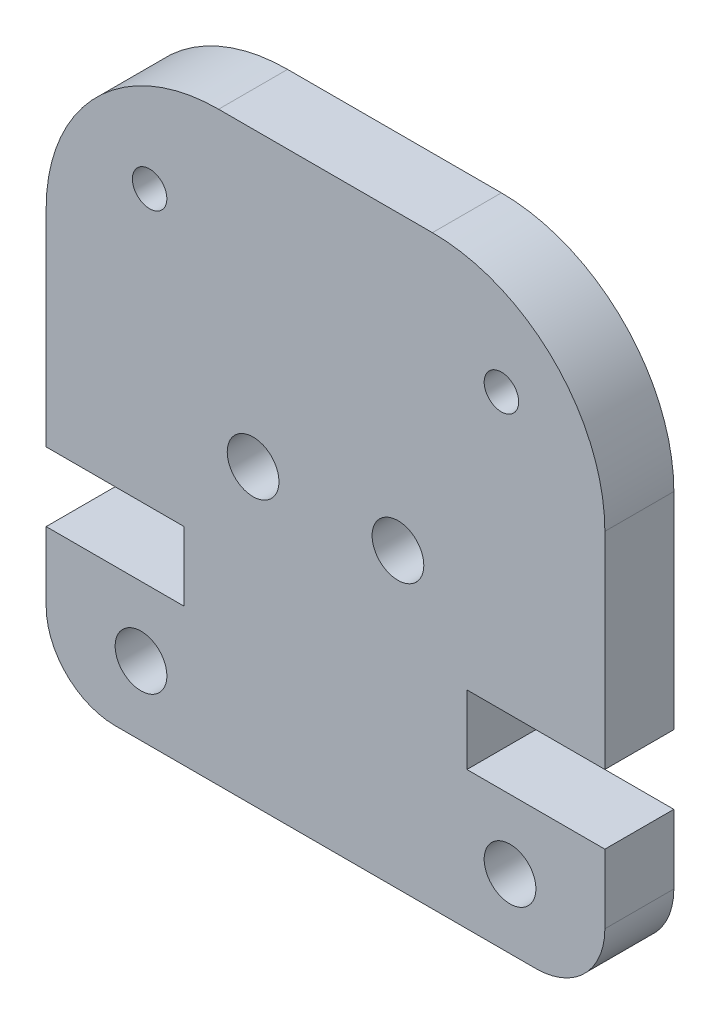
ISO-10303-21;
HEADER;
FILE_DESCRIPTION(('STEP AP214'),'2;1');
FILE_NAME('part.step','',(''),(''),'','','');
FILE_SCHEMA(('AUTOMOTIVE_DESIGN { 1 0 10303 214 1 1 1 1 }'));
ENDSEC;
DATA;
#1=APPLICATION_CONTEXT('core data for automotive mechanical design processes');
#2=APPLICATION_PROTOCOL_DEFINITION('international standard','automotive_design',2000,#1);
#3=PRODUCT_CONTEXT('',#1,'mechanical');
#4=PRODUCT('Part','Part','',(#3));
#5=PRODUCT_RELATED_PRODUCT_CATEGORY('part','',(#4));
#6=PRODUCT_DEFINITION_FORMATION('','',#4);
#7=PRODUCT_DEFINITION_CONTEXT('part definition',#1,'design');
#8=PRODUCT_DEFINITION('design','',#6,#7);
#9=PRODUCT_DEFINITION_SHAPE('','',#8);
#10=(LENGTH_UNIT() NAMED_UNIT(*) SI_UNIT(.MILLI.,.METRE.));
#11=(NAMED_UNIT(*) PLANE_ANGLE_UNIT() SI_UNIT($,.RADIAN.));
#12=(NAMED_UNIT(*) SI_UNIT($,.STERADIAN.) SOLID_ANGLE_UNIT());
#13=UNCERTAINTY_MEASURE_WITH_UNIT(LENGTH_MEASURE(1.E-05),#10,'distance_accuracy_value','');
#14=(GEOMETRIC_REPRESENTATION_CONTEXT(3) GLOBAL_UNCERTAINTY_ASSIGNED_CONTEXT((#13)) GLOBAL_UNIT_ASSIGNED_CONTEXT((#10,
#11,#12)) REPRESENTATION_CONTEXT('',''));
#15=CARTESIAN_POINT('',(0.,0.,0.));
#16=DIRECTION('',(0.,0.,1.));
#17=DIRECTION('',(1.,0.,0.));
#18=AXIS2_PLACEMENT_3D('',#15,#16,#17);
#19=CARTESIAN_POINT('',(-3.09999999999862,11.9799999999986,2.));
#20=DIRECTION('',(0.,0.,-1.));
#21=DIRECTION('',(-1.,0.,0.));
#22=AXIS2_PLACEMENT_3D('',#19,#20,#21);
#23=PLANE('',#22);
#24=CARTESIAN_POINT('',(5.09999999999843,13.9799999999999,2.));
#25=DIRECTION('',(0.,0.,1.));
#26=DIRECTION('',(1.,0.,0.));
#27=AXIS2_PLACEMENT_3D('',#24,#25,#26);
#28=CIRCLE('',#27,0.500000000000168);
#29=CARTESIAN_POINT('',(5.59999999999859,13.9799999999999,2.));
#30=VERTEX_POINT('',#29);
#31=EDGE_CURVE('E352',#30,#30,#28,.T.);
#32=ORIENTED_EDGE('',*,*,#31,.F.);
#33=EDGE_LOOP('',(#32));
#34=FACE_BOUND('',#33,.T.);
#35=CARTESIAN_POINT('',(-2.0999999999983,8.50000000000221,2.));
#36=DIRECTION('',(0.,0.,1.));
#37=DIRECTION('',(-1.,0.,0.));
#38=AXIS2_PLACEMENT_3D('',#35,#36,#37);
#39=CIRCLE('',#38,0.750000000000001);
#40=CARTESIAN_POINT('',(-2.8499999999983,8.50000000000221,2.));
#41=VERTEX_POINT('',#40);
#42=EDGE_CURVE('E364',#41,#41,#39,.T.);
#43=ORIENTED_EDGE('',*,*,#42,.F.);
#44=EDGE_LOOP('',(#43));
#45=FACE_BOUND('',#44,.T.);
#46=CARTESIAN_POINT('',(-5.34999999999999,1.99999999999997,2.));
#47=DIRECTION('',(0.,0.,1.));
#48=DIRECTION('',(-1.,0.,0.));
#49=AXIS2_PLACEMENT_3D('',#46,#47,#48);
#50=CIRCLE('',#49,0.750000000000001);
#51=CARTESIAN_POINT('',(-6.1,1.99999999999997,2.));
#52=VERTEX_POINT('',#51);
#53=EDGE_CURVE('E182',#52,#52,#50,.T.);
#54=ORIENTED_EDGE('',*,*,#53,.F.);
#55=EDGE_LOOP('',(#54));
#56=FACE_BOUND('',#55,.T.);
#57=CARTESIAN_POINT('',(-3.09999999999862,11.9799999999986,2.));
#58=DIRECTION('',(0.,0.,1.));
#59=DIRECTION('',(-1.,0.,0.));
#60=AXIS2_PLACEMENT_3D('',#57,#58,#59);
#61=CIRCLE('',#60,5.00000000000135);
#62=CARTESIAN_POINT('',(-3.09999999999862,16.98,2.));
#63=VERTEX_POINT('',#62);
#64=CARTESIAN_POINT('',(-8.09999999999997,11.9799999999986,2.));
#65=VERTEX_POINT('',#64);
#66=EDGE_CURVE('E209',#63,#65,#61,.T.);
#67=ORIENTED_EDGE('',*,*,#66,.T.);
#68=DIRECTION('',(0.,-1.,0.));
#69=VECTOR('',#68,1.);
#70=CARTESIAN_POINT('',(-8.09999999999997,11.9799999999986,2.));
#71=LINE('',#70,#69);
#72=CARTESIAN_POINT('',(-8.09999999999997,5.99999999999993,2.));
#73=VERTEX_POINT('',#72);
#74=EDGE_CURVE('E117',#65,#73,#71,.T.);
#75=ORIENTED_EDGE('',*,*,#74,.T.);
#76=DIRECTION('',(1.,0.,0.));
#77=VECTOR('',#76,1.);
#78=CARTESIAN_POINT('',(-8.09999999999997,5.99999999999993,2.));
#79=LINE('',#78,#77);
#80=CARTESIAN_POINT('',(-4.10000000000002,5.99999999999993,2.));
#81=VERTEX_POINT('',#80);
#82=EDGE_CURVE('E248',#73,#81,#79,.T.);
#83=ORIENTED_EDGE('',*,*,#82,.T.);
#84=DIRECTION('',(0.,-1.,0.));
#85=VECTOR('',#84,1.);
#86=CARTESIAN_POINT('',(-4.10000000000002,5.99999999999993,2.));
#87=LINE('',#86,#85);
#88=CARTESIAN_POINT('',(-4.10000000000002,3.99999999999995,2.));
#89=VERTEX_POINT('',#88);
#90=EDGE_CURVE('E267',#81,#89,#87,.T.);
#91=ORIENTED_EDGE('',*,*,#90,.T.);
#92=DIRECTION('',(-1.,0.,0.));
#93=VECTOR('',#92,1.);
#94=CARTESIAN_POINT('',(-4.10000000000002,3.99999999999995,2.));
#95=LINE('',#94,#93);
#96=CARTESIAN_POINT('',(-8.09999999999997,3.99999999999995,2.));
#97=VERTEX_POINT('',#96);
#98=EDGE_CURVE('E264',#89,#97,#95,.T.);
#99=ORIENTED_EDGE('',*,*,#98,.T.);
#100=DIRECTION('',(0.,-1.,0.));
#101=VECTOR('',#100,1.);
#102=CARTESIAN_POINT('',(-8.09999999999997,1.99999999999997,2.));
#103=LINE('',#102,#101);
#104=CARTESIAN_POINT('',(-8.09999999999997,1.99999999999997,2.));
#105=VERTEX_POINT('',#104);
#106=EDGE_CURVE('E266',#97,#105,#103,.T.);
#107=ORIENTED_EDGE('',*,*,#106,.T.);
#108=CARTESIAN_POINT('',(-6.1,1.99999999999997,2.));
#109=DIRECTION('',(0.,0.,1.));
#110=DIRECTION('',(-1.,0.,0.));
#111=AXIS2_PLACEMENT_3D('',#108,#109,#110);
#112=CIRCLE('',#111,1.99999999999998);
#113=CARTESIAN_POINT('',(-6.1,0.,2.));
#114=VERTEX_POINT('',#113);
#115=EDGE_CURVE('E269',#105,#114,#112,.T.);
#116=ORIENTED_EDGE('',*,*,#115,.T.);
#117=DIRECTION('',(1.,0.,0.));
#118=VECTOR('',#117,1.);
#119=CARTESIAN_POINT('',(6.1,0.,2.));
#120=LINE('',#119,#118);
#121=CARTESIAN_POINT('',(6.1,0.,2.));
#122=VERTEX_POINT('',#121);
#123=EDGE_CURVE('E275',#114,#122,#120,.T.);
#124=ORIENTED_EDGE('',*,*,#123,.T.);
#125=CARTESIAN_POINT('',(6.1,1.99999999999998,2.));
#126=DIRECTION('',(0.,0.,1.));
#127=DIRECTION('',(1.,0.,0.));
#128=AXIS2_PLACEMENT_3D('',#125,#126,#127);
#129=CIRCLE('',#128,1.99999999999998);
#130=CARTESIAN_POINT('',(8.09999999999997,1.99999999999998,2.));
#131=VERTEX_POINT('',#130);
#132=EDGE_CURVE('E277',#122,#131,#129,.T.);
#133=ORIENTED_EDGE('',*,*,#132,.T.);
#134=DIRECTION('',(0.,1.,0.));
#135=VECTOR('',#134,1.);
#136=CARTESIAN_POINT('',(8.09999999999997,1.99999999999998,2.));
#137=LINE('',#136,#135);
#138=CARTESIAN_POINT('',(8.09999999999997,3.99999999999995,2.));
#139=VERTEX_POINT('',#138);
#140=EDGE_CURVE('E279',#131,#139,#137,.T.);
#141=ORIENTED_EDGE('',*,*,#140,.T.);
#142=DIRECTION('',(-1.,0.,0.));
#143=VECTOR('',#142,1.);
#144=CARTESIAN_POINT('',(4.10000000000002,3.99999999999995,2.));
#145=LINE('',#144,#143);
#146=CARTESIAN_POINT('',(4.10000000000002,3.99999999999995,2.));
#147=VERTEX_POINT('',#146);
#148=EDGE_CURVE('E281',#139,#147,#145,.T.);
#149=ORIENTED_EDGE('',*,*,#148,.T.);
#150=DIRECTION('',(0.,1.,0.));
#151=VECTOR('',#150,1.);
#152=CARTESIAN_POINT('',(4.10000000000002,5.99999999999993,2.));
#153=LINE('',#152,#151);
#154=CARTESIAN_POINT('',(4.10000000000002,5.99999999999993,2.));
#155=VERTEX_POINT('',#154);
#156=EDGE_CURVE('E283',#147,#155,#153,.T.);
#157=ORIENTED_EDGE('',*,*,#156,.T.);
#158=DIRECTION('',(1.,0.,0.));
#159=VECTOR('',#158,1.);
#160=CARTESIAN_POINT('',(8.09999999999997,5.99999999999993,2.));
#161=LINE('',#160,#159);
#162=CARTESIAN_POINT('',(8.09999999999997,5.99999999999993,2.));
#163=VERTEX_POINT('',#162);
#164=EDGE_CURVE('E160',#155,#163,#161,.T.);
#165=ORIENTED_EDGE('',*,*,#164,.T.);
#166=DIRECTION('',(0.,1.,0.));
#167=VECTOR('',#166,1.);
#168=CARTESIAN_POINT('',(8.09999999999997,11.9799999999986,2.));
#169=LINE('',#168,#167);
#170=CARTESIAN_POINT('',(8.09999999999997,11.9799999999986,2.));
#171=VERTEX_POINT('',#170);
#172=EDGE_CURVE('E154',#163,#171,#169,.T.);
#173=ORIENTED_EDGE('',*,*,#172,.T.);
#174=CARTESIAN_POINT('',(3.09999999999862,11.9799999999986,2.));
#175=DIRECTION('',(0.,0.,1.));
#176=DIRECTION('',(1.,0.,0.));
#177=AXIS2_PLACEMENT_3D('',#174,#175,#176);
#178=CIRCLE('',#177,5.00000000000135);
#179=CARTESIAN_POINT('',(3.09999999999862,16.98,2.));
#180=VERTEX_POINT('',#179);
#181=EDGE_CURVE('E158',#171,#180,#178,.T.);
#182=ORIENTED_EDGE('',*,*,#181,.T.);
#183=DIRECTION('',(-1.,0.,0.));
#184=VECTOR('',#183,1.);
#185=CARTESIAN_POINT('',(3.09999999999862,16.98,2.));
#186=LINE('',#185,#184);
#187=EDGE_CURVE('E50',#180,#63,#186,.T.);
#188=ORIENTED_EDGE('',*,*,#187,.T.);
#189=EDGE_LOOP('',(#67,#75,#83,#91,#99,#107,#116,#124,#133,#141,#149,#157,#165,#173,#182,#188));
#190=FACE_BOUND('',#189,.T.);
#191=CARTESIAN_POINT('',(-5.09999999999843,13.9799999999999,2.));
#192=DIRECTION('',(0.,0.,1.));
#193=DIRECTION('',(-1.,0.,0.));
#194=AXIS2_PLACEMENT_3D('',#191,#192,#193);
#195=CIRCLE('',#194,0.500000000000161);
#196=CARTESIAN_POINT('',(-5.59999999999859,13.9799999999999,2.));
#197=VERTEX_POINT('',#196);
#198=EDGE_CURVE('E370',#197,#197,#195,.T.);
#199=ORIENTED_EDGE('',*,*,#198,.F.);
#200=EDGE_LOOP('',(#199));
#201=FACE_BOUND('',#200,.T.);
#202=CARTESIAN_POINT('',(2.0999999999983,8.50000000000221,2.));
#203=DIRECTION('',(0.,0.,1.));
#204=DIRECTION('',(1.,0.,0.));
#205=AXIS2_PLACEMENT_3D('',#202,#203,#204);
#206=CIRCLE('',#205,0.750000000000001);
#207=CARTESIAN_POINT('',(2.8499999999983,8.50000000000221,2.));
#208=VERTEX_POINT('',#207);
#209=EDGE_CURVE('E358',#208,#208,#206,.T.);
#210=ORIENTED_EDGE('',*,*,#209,.F.);
#211=EDGE_LOOP('',(#210));
#212=FACE_BOUND('',#211,.T.);
#213=CARTESIAN_POINT('',(5.35,1.99999999999998,2.));
#214=DIRECTION('',(0.,0.,1.));
#215=DIRECTION('',(1.,0.,0.));
#216=AXIS2_PLACEMENT_3D('',#213,#214,#215);
#217=CIRCLE('',#216,0.750000000000001);
#218=CARTESIAN_POINT('',(6.1,1.99999999999998,2.));
#219=VERTEX_POINT('',#218);
#220=EDGE_CURVE('E343',#219,#219,#217,.T.);
#221=ORIENTED_EDGE('',*,*,#220,.F.);
#222=EDGE_LOOP('',(#221));
#223=FACE_BOUND('',#222,.T.);
#224=ADVANCED_FACE('F33',(#34,#45,#56,#190,#201,#212,#223),#23,.F.);
#225=CARTESIAN_POINT('',(-3.09999999999862,11.9799999999986,0.));
#226=DIRECTION('',(0.,0.,-1.));
#227=DIRECTION('',(-1.,0.,0.));
#228=AXIS2_PLACEMENT_3D('',#225,#226,#227);
#229=PLANE('',#228);
#230=CARTESIAN_POINT('',(5.09999999999843,13.9799999999999,0.));
#231=DIRECTION('',(0.,0.,1.));
#232=DIRECTION('',(1.,0.,0.));
#233=AXIS2_PLACEMENT_3D('',#230,#231,#232);
#234=CIRCLE('',#233,0.500000000000168);
#235=CARTESIAN_POINT('',(5.59999999999859,13.9799999999999,0.));
#236=VERTEX_POINT('',#235);
#237=EDGE_CURVE('E349',#236,#236,#234,.T.);
#238=ORIENTED_EDGE('',*,*,#237,.T.);
#239=EDGE_LOOP('',(#238));
#240=FACE_BOUND('',#239,.T.);
#241=CARTESIAN_POINT('',(-2.0999999999983,8.50000000000221,0.));
#242=DIRECTION('',(0.,0.,1.));
#243=DIRECTION('',(-1.,0.,0.));
#244=AXIS2_PLACEMENT_3D('',#241,#242,#243);
#245=CIRCLE('',#244,0.750000000000001);
#246=CARTESIAN_POINT('',(-2.8499999999983,8.50000000000221,0.));
#247=VERTEX_POINT('',#246);
#248=EDGE_CURVE('E361',#247,#247,#245,.T.);
#249=ORIENTED_EDGE('',*,*,#248,.T.);
#250=EDGE_LOOP('',(#249));
#251=FACE_BOUND('',#250,.T.);
#252=CARTESIAN_POINT('',(-5.34999999999999,1.99999999999997,0.));
#253=DIRECTION('',(0.,0.,1.));
#254=DIRECTION('',(-1.,0.,0.));
#255=AXIS2_PLACEMENT_3D('',#252,#253,#254);
#256=CIRCLE('',#255,0.750000000000001);
#257=CARTESIAN_POINT('',(-6.1,1.99999999999997,0.));
#258=VERTEX_POINT('',#257);
#259=EDGE_CURVE('E373',#258,#258,#256,.T.);
#260=ORIENTED_EDGE('',*,*,#259,.T.);
#261=EDGE_LOOP('',(#260));
#262=FACE_BOUND('',#261,.T.);
#263=CARTESIAN_POINT('',(-3.09999999999862,11.9799999999986,0.));
#264=DIRECTION('',(0.,0.,1.));
#265=DIRECTION('',(-1.,0.,0.));
#266=AXIS2_PLACEMENT_3D('',#263,#264,#265);
#267=CIRCLE('',#266,5.00000000000135);
#268=CARTESIAN_POINT('',(-3.09999999999862,16.98,0.));
#269=VERTEX_POINT('',#268);
#270=CARTESIAN_POINT('',(-8.09999999999997,11.9799999999986,0.));
#271=VERTEX_POINT('',#270);
#272=EDGE_CURVE('E178',#269,#271,#267,.T.);
#273=ORIENTED_EDGE('',*,*,#272,.F.);
#274=DIRECTION('',(-1.,0.,0.));
#275=VECTOR('',#274,1.);
#276=CARTESIAN_POINT('',(3.09999999999862,16.98,0.));
#277=LINE('',#276,#275);
#278=CARTESIAN_POINT('',(3.09999999999862,16.98,0.));
#279=VERTEX_POINT('',#278);
#280=EDGE_CURVE('E109',#279,#269,#277,.T.);
#281=ORIENTED_EDGE('',*,*,#280,.F.);
#282=CARTESIAN_POINT('',(3.09999999999862,11.9799999999986,0.));
#283=DIRECTION('',(0.,0.,1.));
#284=DIRECTION('',(1.,0.,0.));
#285=AXIS2_PLACEMENT_3D('',#282,#283,#284);
#286=CIRCLE('',#285,5.00000000000135);
#287=CARTESIAN_POINT('',(8.09999999999997,11.9799999999986,0.));
#288=VERTEX_POINT('',#287);
#289=EDGE_CURVE('E103',#288,#279,#286,.T.);
#290=ORIENTED_EDGE('',*,*,#289,.F.);
#291=DIRECTION('',(0.,1.,0.));
#292=VECTOR('',#291,1.);
#293=CARTESIAN_POINT('',(8.09999999999997,11.9799999999986,0.));
#294=LINE('',#293,#292);
#295=CARTESIAN_POINT('',(8.09999999999997,5.99999999999993,0.));
#296=VERTEX_POINT('',#295);
#297=EDGE_CURVE('E168',#296,#288,#294,.T.);
#298=ORIENTED_EDGE('',*,*,#297,.F.);
#299=DIRECTION('',(1.,0.,0.));
#300=VECTOR('',#299,1.);
#301=CARTESIAN_POINT('',(8.09999999999997,5.99999999999993,0.));
#302=LINE('',#301,#300);
#303=CARTESIAN_POINT('',(4.10000000000002,5.99999999999993,0.));
#304=VERTEX_POINT('',#303);
#305=EDGE_CURVE('E204',#304,#296,#302,.T.);
#306=ORIENTED_EDGE('',*,*,#305,.F.);
#307=DIRECTION('',(0.,1.,0.));
#308=VECTOR('',#307,1.);
#309=CARTESIAN_POINT('',(4.10000000000002,5.99999999999993,0.));
#310=LINE('',#309,#308);
#311=CARTESIAN_POINT('',(4.10000000000002,3.99999999999995,0.));
#312=VERTEX_POINT('',#311);
#313=EDGE_CURVE('E202',#312,#304,#310,.T.);
#314=ORIENTED_EDGE('',*,*,#313,.F.);
#315=DIRECTION('',(-1.,0.,0.));
#316=VECTOR('',#315,1.);
#317=CARTESIAN_POINT('',(4.10000000000002,3.99999999999995,0.));
#318=LINE('',#317,#316);
#319=CARTESIAN_POINT('',(8.09999999999997,3.99999999999995,0.));
#320=VERTEX_POINT('',#319);
#321=EDGE_CURVE('E200',#320,#312,#318,.T.);
#322=ORIENTED_EDGE('',*,*,#321,.F.);
#323=DIRECTION('',(0.,1.,0.));
#324=VECTOR('',#323,1.);
#325=CARTESIAN_POINT('',(8.09999999999997,1.99999999999998,0.));
#326=LINE('',#325,#324);
#327=CARTESIAN_POINT('',(8.09999999999997,1.99999999999998,0.));
#328=VERTEX_POINT('',#327);
#329=EDGE_CURVE('E198',#328,#320,#326,.T.);
#330=ORIENTED_EDGE('',*,*,#329,.F.);
#331=CARTESIAN_POINT('',(6.1,1.99999999999998,0.));
#332=DIRECTION('',(0.,0.,1.));
#333=DIRECTION('',(1.,0.,0.));
#334=AXIS2_PLACEMENT_3D('',#331,#332,#333);
#335=CIRCLE('',#334,1.99999999999998);
#336=CARTESIAN_POINT('',(6.1,0.,0.));
#337=VERTEX_POINT('',#336);
#338=EDGE_CURVE('E196',#337,#328,#335,.T.);
#339=ORIENTED_EDGE('',*,*,#338,.F.);
#340=DIRECTION('',(1.,0.,0.));
#341=VECTOR('',#340,1.);
#342=CARTESIAN_POINT('',(6.1,0.,0.));
#343=LINE('',#342,#341);
#344=CARTESIAN_POINT('',(-6.1,0.,0.));
#345=VERTEX_POINT('',#344);
#346=EDGE_CURVE('E194',#345,#337,#343,.T.);
#347=ORIENTED_EDGE('',*,*,#346,.F.);
#348=CARTESIAN_POINT('',(-6.1,1.99999999999997,0.));
#349=DIRECTION('',(0.,0.,1.));
#350=DIRECTION('',(-1.,0.,0.));
#351=AXIS2_PLACEMENT_3D('',#348,#349,#350);
#352=CIRCLE('',#351,1.99999999999998);
#353=CARTESIAN_POINT('',(-8.09999999999997,1.99999999999997,0.));
#354=VERTEX_POINT('',#353);
#355=EDGE_CURVE('E192',#354,#345,#352,.T.);
#356=ORIENTED_EDGE('',*,*,#355,.F.);
#357=DIRECTION('',(0.,-1.,0.));
#358=VECTOR('',#357,1.);
#359=CARTESIAN_POINT('',(-8.09999999999997,1.99999999999997,0.));
#360=LINE('',#359,#358);
#361=CARTESIAN_POINT('',(-8.09999999999997,3.99999999999995,0.));
#362=VERTEX_POINT('',#361);
#363=EDGE_CURVE('E190',#362,#354,#360,.T.);
#364=ORIENTED_EDGE('',*,*,#363,.F.);
#365=DIRECTION('',(-1.,0.,0.));
#366=VECTOR('',#365,1.);
#367=CARTESIAN_POINT('',(-4.10000000000002,3.99999999999995,0.));
#368=LINE('',#367,#366);
#369=CARTESIAN_POINT('',(-4.10000000000002,3.99999999999995,0.));
#370=VERTEX_POINT('',#369);
#371=EDGE_CURVE('E188',#370,#362,#368,.T.);
#372=ORIENTED_EDGE('',*,*,#371,.F.);
#373=DIRECTION('',(0.,-1.,0.));
#374=VECTOR('',#373,1.);
#375=CARTESIAN_POINT('',(-4.10000000000002,5.99999999999993,0.));
#376=LINE('',#375,#374);
#377=CARTESIAN_POINT('',(-4.10000000000002,5.99999999999993,0.));
#378=VERTEX_POINT('',#377);
#379=EDGE_CURVE('E186',#378,#370,#376,.T.);
#380=ORIENTED_EDGE('',*,*,#379,.F.);
#381=DIRECTION('',(1.,0.,0.));
#382=VECTOR('',#381,1.);
#383=CARTESIAN_POINT('',(-8.09999999999997,5.99999999999993,0.));
#384=LINE('',#383,#382);
#385=CARTESIAN_POINT('',(-8.09999999999997,5.99999999999993,0.));
#386=VERTEX_POINT('',#385);
#387=EDGE_CURVE('E184',#386,#378,#384,.T.);
#388=ORIENTED_EDGE('',*,*,#387,.F.);
#389=DIRECTION('',(0.,-1.,0.));
#390=VECTOR('',#389,1.);
#391=CARTESIAN_POINT('',(-8.09999999999997,11.9799999999986,0.));
#392=LINE('',#391,#390);
#393=EDGE_CURVE('E181',#271,#386,#392,.T.);
#394=ORIENTED_EDGE('',*,*,#393,.F.);
#395=EDGE_LOOP('',(#273,#281,#290,#298,#306,#314,#322,#330,#339,#347,#356,#364,#372,#380,#388,#394));
#396=FACE_BOUND('',#395,.T.);
#397=CARTESIAN_POINT('',(-5.09999999999843,13.9799999999999,0.));
#398=DIRECTION('',(0.,0.,1.));
#399=DIRECTION('',(-1.,0.,0.));
#400=AXIS2_PLACEMENT_3D('',#397,#398,#399);
#401=CIRCLE('',#400,0.500000000000161);
#402=CARTESIAN_POINT('',(-5.59999999999859,13.9799999999999,0.));
#403=VERTEX_POINT('',#402);
#404=EDGE_CURVE('E367',#403,#403,#401,.T.);
#405=ORIENTED_EDGE('',*,*,#404,.T.);
#406=EDGE_LOOP('',(#405));
#407=FACE_BOUND('',#406,.T.);
#408=CARTESIAN_POINT('',(2.0999999999983,8.50000000000221,0.));
#409=DIRECTION('',(0.,0.,1.));
#410=DIRECTION('',(1.,0.,0.));
#411=AXIS2_PLACEMENT_3D('',#408,#409,#410);
#412=CIRCLE('',#411,0.750000000000001);
#413=CARTESIAN_POINT('',(2.8499999999983,8.50000000000221,0.));
#414=VERTEX_POINT('',#413);
#415=EDGE_CURVE('E355',#414,#414,#412,.T.);
#416=ORIENTED_EDGE('',*,*,#415,.T.);
#417=EDGE_LOOP('',(#416));
#418=FACE_BOUND('',#417,.T.);
#419=CARTESIAN_POINT('',(5.35,1.99999999999998,0.));
#420=DIRECTION('',(0.,0.,1.));
#421=DIRECTION('',(1.,0.,0.));
#422=AXIS2_PLACEMENT_3D('',#419,#420,#421);
#423=CIRCLE('',#422,0.750000000000001);
#424=CARTESIAN_POINT('',(6.1,1.99999999999998,0.));
#425=VERTEX_POINT('',#424);
#426=EDGE_CURVE('E346',#425,#425,#423,.T.);
#427=ORIENTED_EDGE('',*,*,#426,.T.);
#428=EDGE_LOOP('',(#427));
#429=FACE_BOUND('',#428,.T.);
#430=ADVANCED_FACE('F252',(#240,#251,#262,#396,#407,#418,#429),#229,.T.);
#431=CARTESIAN_POINT('',(-3.09999999999862,11.9799999999986,2.));
#432=DIRECTION('',(0.,0.,-1.));
#433=DIRECTION('',(-1.,0.,0.));
#434=AXIS2_PLACEMENT_3D('',#431,#432,#433);
#435=CYLINDRICAL_SURFACE('',#434,5.00000000000135);
#436=ORIENTED_EDGE('',*,*,#272,.T.);
#437=DIRECTION('',(0.,0.,-1.));
#438=VECTOR('',#437,1.);
#439=CARTESIAN_POINT('',(-8.09999999999997,11.9799999999986,2.));
#440=LINE('',#439,#438);
#441=EDGE_CURVE('E11',#65,#271,#440,.T.);
#442=ORIENTED_EDGE('',*,*,#441,.F.);
#443=ORIENTED_EDGE('',*,*,#66,.F.);
#444=DIRECTION('',(0.,0.,-1.));
#445=VECTOR('',#444,1.);
#446=CARTESIAN_POINT('',(-3.09999999999862,16.98,2.));
#447=LINE('',#446,#445);
#448=EDGE_CURVE('E174',#63,#269,#447,.T.);
#449=ORIENTED_EDGE('',*,*,#448,.T.);
#450=EDGE_LOOP('',(#436,#442,#443,#449));
#451=FACE_BOUND('',#450,.T.);
#452=ADVANCED_FACE('F35',(#451),#435,.T.);
#453=CARTESIAN_POINT('',(-8.09999999999997,11.9799999999986,2.));
#454=DIRECTION('',(1.,0.,0.));
#455=DIRECTION('',(0.,1.,0.));
#456=AXIS2_PLACEMENT_3D('',#453,#454,#455);
#457=PLANE('',#456);
#458=ORIENTED_EDGE('',*,*,#393,.T.);
#459=DIRECTION('',(0.,0.,-1.));
#460=VECTOR('',#459,1.);
#461=CARTESIAN_POINT('',(-8.09999999999997,5.99999999999993,2.));
#462=LINE('',#461,#460);
#463=EDGE_CURVE('E42',#73,#386,#462,.T.);
#464=ORIENTED_EDGE('',*,*,#463,.F.);
#465=ORIENTED_EDGE('',*,*,#74,.F.);
#466=ORIENTED_EDGE('',*,*,#441,.T.);
#467=EDGE_LOOP('',(#458,#464,#465,#466));
#468=FACE_BOUND('',#467,.T.);
#469=ADVANCED_FACE('F540',(#468),#457,.F.);
#470=CARTESIAN_POINT('',(-8.09999999999997,5.99999999999993,2.));
#471=DIRECTION('',(0.,1.,0.));
#472=DIRECTION('',(-1.,0.,0.));
#473=AXIS2_PLACEMENT_3D('',#470,#471,#472);
#474=PLANE('',#473);
#475=ORIENTED_EDGE('',*,*,#387,.T.);
#476=DIRECTION('',(0.,0.,-1.));
#477=VECTOR('',#476,1.);
#478=CARTESIAN_POINT('',(-4.10000000000002,5.99999999999993,2.));
#479=LINE('',#478,#477);
#480=EDGE_CURVE('E240',#81,#378,#479,.T.);
#481=ORIENTED_EDGE('',*,*,#480,.F.);
#482=ORIENTED_EDGE('',*,*,#82,.F.);
#483=ORIENTED_EDGE('',*,*,#463,.T.);
#484=EDGE_LOOP('',(#475,#481,#482,#483));
#485=FACE_BOUND('',#484,.T.);
#486=ADVANCED_FACE('F246',(#485),#474,.F.);
#487=CARTESIAN_POINT('',(-4.10000000000002,5.99999999999993,2.));
#488=DIRECTION('',(1.,0.,0.));
#489=DIRECTION('',(0.,0.,-1.));
#490=AXIS2_PLACEMENT_3D('',#487,#488,#489);
#491=PLANE('',#490);
#492=ORIENTED_EDGE('',*,*,#379,.T.);
#493=DIRECTION('',(0.,0.,-1.));
#494=VECTOR('',#493,1.);
#495=CARTESIAN_POINT('',(-4.10000000000002,3.99999999999995,2.));
#496=LINE('',#495,#494);
#497=EDGE_CURVE('E237',#89,#370,#496,.T.);
#498=ORIENTED_EDGE('',*,*,#497,.F.);
#499=ORIENTED_EDGE('',*,*,#90,.F.);
#500=ORIENTED_EDGE('',*,*,#480,.T.);
#501=EDGE_LOOP('',(#492,#498,#499,#500));
#502=FACE_BOUND('',#501,.T.);
#503=ADVANCED_FACE('F258',(#502),#491,.F.);
#504=CARTESIAN_POINT('',(-4.10000000000002,3.99999999999995,2.));
#505=DIRECTION('',(0.,-1.,0.));
#506=DIRECTION('',(1.,0.,0.));
#507=AXIS2_PLACEMENT_3D('',#504,#505,#506);
#508=PLANE('',#507);
#509=ORIENTED_EDGE('',*,*,#371,.T.);
#510=DIRECTION('',(0.,0.,-1.));
#511=VECTOR('',#510,1.);
#512=CARTESIAN_POINT('',(-8.09999999999997,3.99999999999995,2.));
#513=LINE('',#512,#511);
#514=EDGE_CURVE('E234',#97,#362,#513,.T.);
#515=ORIENTED_EDGE('',*,*,#514,.F.);
#516=ORIENTED_EDGE('',*,*,#98,.F.);
#517=ORIENTED_EDGE('',*,*,#497,.T.);
#518=EDGE_LOOP('',(#509,#515,#516,#517));
#519=FACE_BOUND('',#518,.T.);
#520=ADVANCED_FACE('F262',(#519),#508,.F.);
#521=CARTESIAN_POINT('',(-8.09999999999997,1.99999999999997,2.));
#522=DIRECTION('',(1.,0.,0.));
#523=DIRECTION('',(0.,0.,-1.));
#524=AXIS2_PLACEMENT_3D('',#521,#522,#523);
#525=PLANE('',#524);
#526=ORIENTED_EDGE('',*,*,#363,.T.);
#527=DIRECTION('',(0.,0.,-1.));
#528=VECTOR('',#527,1.);
#529=CARTESIAN_POINT('',(-8.09999999999997,1.99999999999997,2.));
#530=LINE('',#529,#528);
#531=EDGE_CURVE('E231',#105,#354,#530,.T.);
#532=ORIENTED_EDGE('',*,*,#531,.F.);
#533=ORIENTED_EDGE('',*,*,#106,.F.);
#534=ORIENTED_EDGE('',*,*,#514,.T.);
#535=EDGE_LOOP('',(#526,#532,#533,#534));
#536=FACE_BOUND('',#535,.T.);
#537=ADVANCED_FACE('F505',(#536),#525,.F.);
#538=CARTESIAN_POINT('',(-6.1,1.99999999999997,2.));
#539=DIRECTION('',(0.,0.,-1.));
#540=DIRECTION('',(-1.,0.,0.));
#541=AXIS2_PLACEMENT_3D('',#538,#539,#540);
#542=CYLINDRICAL_SURFACE('',#541,1.99999999999998);
#543=ORIENTED_EDGE('',*,*,#355,.T.);
#544=DIRECTION('',(0.,0.,-1.));
#545=VECTOR('',#544,1.);
#546=CARTESIAN_POINT('',(-6.1,0.,2.));
#547=LINE('',#546,#545);
#548=EDGE_CURVE('E228',#114,#345,#547,.T.);
#549=ORIENTED_EDGE('',*,*,#548,.F.);
#550=ORIENTED_EDGE('',*,*,#115,.F.);
#551=ORIENTED_EDGE('',*,*,#531,.T.);
#552=EDGE_LOOP('',(#543,#549,#550,#551));
#553=FACE_BOUND('',#552,.T.);
#554=ADVANCED_FACE('F495',(#553),#542,.T.);
#555=CARTESIAN_POINT('',(6.1,0.,2.));
#556=DIRECTION('',(0.,1.,0.));
#557=DIRECTION('',(-1.,0.,0.));
#558=AXIS2_PLACEMENT_3D('',#555,#556,#557);
#559=PLANE('',#558);
#560=ORIENTED_EDGE('',*,*,#346,.T.);
#561=DIRECTION('',(0.,0.,-1.));
#562=VECTOR('',#561,1.);
#563=CARTESIAN_POINT('',(6.1,0.,2.));
#564=LINE('',#563,#562);
#565=EDGE_CURVE('E225',#122,#337,#564,.T.);
#566=ORIENTED_EDGE('',*,*,#565,.F.);
#567=ORIENTED_EDGE('',*,*,#123,.F.);
#568=ORIENTED_EDGE('',*,*,#548,.T.);
#569=EDGE_LOOP('',(#560,#566,#567,#568));
#570=FACE_BOUND('',#569,.T.);
#571=ADVANCED_FACE('F485',(#570),#559,.F.);
#572=CARTESIAN_POINT('',(6.1,1.99999999999998,2.));
#573=DIRECTION('',(0.,0.,-1.));
#574=DIRECTION('',(-1.,0.,0.));
#575=AXIS2_PLACEMENT_3D('',#572,#573,#574);
#576=CYLINDRICAL_SURFACE('',#575,1.99999999999998);
#577=ORIENTED_EDGE('',*,*,#338,.T.);
#578=DIRECTION('',(0.,0.,-1.));
#579=VECTOR('',#578,1.);
#580=CARTESIAN_POINT('',(8.09999999999997,1.99999999999998,2.));
#581=LINE('',#580,#579);
#582=EDGE_CURVE('E222',#131,#328,#581,.T.);
#583=ORIENTED_EDGE('',*,*,#582,.F.);
#584=ORIENTED_EDGE('',*,*,#132,.F.);
#585=ORIENTED_EDGE('',*,*,#565,.T.);
#586=EDGE_LOOP('',(#577,#583,#584,#585));
#587=FACE_BOUND('',#586,.T.);
#588=ADVANCED_FACE('F475',(#587),#576,.T.);
#589=CARTESIAN_POINT('',(8.09999999999997,1.99999999999998,2.));
#590=DIRECTION('',(-1.,0.,0.));
#591=DIRECTION('',(0.,0.,1.));
#592=AXIS2_PLACEMENT_3D('',#589,#590,#591);
#593=PLANE('',#592);
#594=ORIENTED_EDGE('',*,*,#329,.T.);
#595=DIRECTION('',(0.,0.,-1.));
#596=VECTOR('',#595,1.);
#597=CARTESIAN_POINT('',(8.09999999999997,3.99999999999995,2.));
#598=LINE('',#597,#596);
#599=EDGE_CURVE('E219',#139,#320,#598,.T.);
#600=ORIENTED_EDGE('',*,*,#599,.F.);
#601=ORIENTED_EDGE('',*,*,#140,.F.);
#602=ORIENTED_EDGE('',*,*,#582,.T.);
#603=EDGE_LOOP('',(#594,#600,#601,#602));
#604=FACE_BOUND('',#603,.T.);
#605=ADVANCED_FACE('F465',(#604),#593,.F.);
#606=CARTESIAN_POINT('',(4.10000000000002,3.99999999999995,2.));
#607=DIRECTION('',(0.,-1.,0.));
#608=DIRECTION('',(0.,0.,-1.));
#609=AXIS2_PLACEMENT_3D('',#606,#607,#608);
#610=PLANE('',#609);
#611=ORIENTED_EDGE('',*,*,#321,.T.);
#612=DIRECTION('',(0.,0.,-1.));
#613=VECTOR('',#612,1.);
#614=CARTESIAN_POINT('',(4.10000000000002,3.99999999999995,2.));
#615=LINE('',#614,#613);
#616=EDGE_CURVE('E216',#147,#312,#615,.T.);
#617=ORIENTED_EDGE('',*,*,#616,.F.);
#618=ORIENTED_EDGE('',*,*,#148,.F.);
#619=ORIENTED_EDGE('',*,*,#599,.T.);
#620=EDGE_LOOP('',(#611,#617,#618,#619));
#621=FACE_BOUND('',#620,.T.);
#622=ADVANCED_FACE('F456',(#621),#610,.F.);
#623=CARTESIAN_POINT('',(4.10000000000002,5.99999999999993,2.));
#624=DIRECTION('',(-1.,0.,0.));
#625=DIRECTION('',(0.,0.,1.));
#626=AXIS2_PLACEMENT_3D('',#623,#624,#625);
#627=PLANE('',#626);
#628=ORIENTED_EDGE('',*,*,#313,.T.);
#629=DIRECTION('',(0.,0.,-1.));
#630=VECTOR('',#629,1.);
#631=CARTESIAN_POINT('',(4.10000000000002,5.99999999999993,2.));
#632=LINE('',#631,#630);
#633=EDGE_CURVE('E213',#155,#304,#632,.T.);
#634=ORIENTED_EDGE('',*,*,#633,.F.);
#635=ORIENTED_EDGE('',*,*,#156,.F.);
#636=ORIENTED_EDGE('',*,*,#616,.T.);
#637=EDGE_LOOP('',(#628,#634,#635,#636));
#638=FACE_BOUND('',#637,.T.);
#639=ADVANCED_FACE('F289',(#638),#627,.F.);
#640=CARTESIAN_POINT('',(8.09999999999997,5.99999999999993,2.));
#641=DIRECTION('',(0.,1.,0.));
#642=DIRECTION('',(0.,0.,1.));
#643=AXIS2_PLACEMENT_3D('',#640,#641,#642);
#644=PLANE('',#643);
#645=ORIENTED_EDGE('',*,*,#305,.T.);
#646=DIRECTION('',(0.,0.,-1.));
#647=VECTOR('',#646,1.);
#648=CARTESIAN_POINT('',(8.09999999999997,5.99999999999993,2.));
#649=LINE('',#648,#647);
#650=EDGE_CURVE('E169',#163,#296,#649,.T.);
#651=ORIENTED_EDGE('',*,*,#650,.F.);
#652=ORIENTED_EDGE('',*,*,#164,.F.);
#653=ORIENTED_EDGE('',*,*,#633,.T.);
#654=EDGE_LOOP('',(#645,#651,#652,#653));
#655=FACE_BOUND('',#654,.T.);
#656=ADVANCED_FACE('F293',(#655),#644,.F.);
#657=CARTESIAN_POINT('',(8.09999999999997,11.9799999999986,2.));
#658=DIRECTION('',(-1.,0.,0.));
#659=DIRECTION('',(0.,-1.,0.));
#660=AXIS2_PLACEMENT_3D('',#657,#658,#659);
#661=PLANE('',#660);
#662=ORIENTED_EDGE('',*,*,#297,.T.);
#663=DIRECTION('',(0.,0.,-1.));
#664=VECTOR('',#663,1.);
#665=CARTESIAN_POINT('',(8.09999999999997,11.9799999999986,2.));
#666=LINE('',#665,#664);
#667=EDGE_CURVE('E165',#171,#288,#666,.T.);
#668=ORIENTED_EDGE('',*,*,#667,.F.);
#669=ORIENTED_EDGE('',*,*,#172,.F.);
#670=ORIENTED_EDGE('',*,*,#650,.T.);
#671=EDGE_LOOP('',(#662,#668,#669,#670));
#672=FACE_BOUND('',#671,.T.);
#673=ADVANCED_FACE('F166',(#672),#661,.F.);
#674=CARTESIAN_POINT('',(3.09999999999862,11.9799999999986,2.));
#675=DIRECTION('',(0.,0.,-1.));
#676=DIRECTION('',(-1.,0.,0.));
#677=AXIS2_PLACEMENT_3D('',#674,#675,#676);
#678=CYLINDRICAL_SURFACE('',#677,5.00000000000135);
#679=ORIENTED_EDGE('',*,*,#289,.T.);
#680=DIRECTION('',(0.,0.,-1.));
#681=VECTOR('',#680,1.);
#682=CARTESIAN_POINT('',(3.09999999999862,16.98,2.));
#683=LINE('',#682,#681);
#684=EDGE_CURVE('E170',#180,#279,#683,.T.);
#685=ORIENTED_EDGE('',*,*,#684,.F.);
#686=ORIENTED_EDGE('',*,*,#181,.F.);
#687=ORIENTED_EDGE('',*,*,#667,.T.);
#688=EDGE_LOOP('',(#679,#685,#686,#687));
#689=FACE_BOUND('',#688,.T.);
#690=ADVANCED_FACE('F172',(#689),#678,.T.);
#691=CARTESIAN_POINT('',(3.09999999999862,16.98,2.));
#692=DIRECTION('',(0.,-1.,0.));
#693=DIRECTION('',(0.,0.,-1.));
#694=AXIS2_PLACEMENT_3D('',#691,#692,#693);
#695=PLANE('',#694);
#696=ORIENTED_EDGE('',*,*,#280,.T.);
#697=ORIENTED_EDGE('',*,*,#448,.F.);
#698=ORIENTED_EDGE('',*,*,#187,.F.);
#699=ORIENTED_EDGE('',*,*,#684,.T.);
#700=EDGE_LOOP('',(#696,#697,#698,#699));
#701=FACE_BOUND('',#700,.T.);
#702=ADVANCED_FACE('F297',(#701),#695,.F.);
#703=CARTESIAN_POINT('',(-5.34999999999999,1.99999999999997,2.));
#704=DIRECTION('',(0.,0.,-1.));
#705=DIRECTION('',(-1.,0.,0.));
#706=AXIS2_PLACEMENT_3D('',#703,#704,#705);
#707=CYLINDRICAL_SURFACE('',#706,0.750000000000001);
#708=ORIENTED_EDGE('',*,*,#53,.T.);
#709=EDGE_LOOP('',(#708));
#710=FACE_BOUND('',#709,.T.);
#711=ORIENTED_EDGE('',*,*,#259,.F.);
#712=EDGE_LOOP('',(#711));
#713=FACE_BOUND('',#712,.T.);
#714=ADVANCED_FACE('F299',(#710,#713),#707,.F.);
#715=CARTESIAN_POINT('',(-5.09999999999843,13.9799999999999,2.));
#716=DIRECTION('',(0.,0.,-1.));
#717=DIRECTION('',(-1.,0.,0.));
#718=AXIS2_PLACEMENT_3D('',#715,#716,#717);
#719=CYLINDRICAL_SURFACE('',#718,0.500000000000161);
#720=ORIENTED_EDGE('',*,*,#198,.T.);
#721=EDGE_LOOP('',(#720));
#722=FACE_BOUND('',#721,.T.);
#723=ORIENTED_EDGE('',*,*,#404,.F.);
#724=EDGE_LOOP('',(#723));
#725=FACE_BOUND('',#724,.T.);
#726=ADVANCED_FACE('F305',(#722,#725),#719,.F.);
#727=CARTESIAN_POINT('',(-2.0999999999983,8.50000000000221,2.));
#728=DIRECTION('',(0.,0.,-1.));
#729=DIRECTION('',(-1.,0.,0.));
#730=AXIS2_PLACEMENT_3D('',#727,#728,#729);
#731=CYLINDRICAL_SURFACE('',#730,0.750000000000001);
#732=ORIENTED_EDGE('',*,*,#42,.T.);
#733=EDGE_LOOP('',(#732));
#734=FACE_BOUND('',#733,.T.);
#735=ORIENTED_EDGE('',*,*,#248,.F.);
#736=EDGE_LOOP('',(#735));
#737=FACE_BOUND('',#736,.T.);
#738=ADVANCED_FACE('F322',(#734,#737),#731,.F.);
#739=CARTESIAN_POINT('',(2.0999999999983,8.50000000000221,2.));
#740=DIRECTION('',(0.,0.,-1.));
#741=DIRECTION('',(-1.,0.,0.));
#742=AXIS2_PLACEMENT_3D('',#739,#740,#741);
#743=CYLINDRICAL_SURFACE('',#742,0.750000000000001);
#744=ORIENTED_EDGE('',*,*,#209,.T.);
#745=EDGE_LOOP('',(#744));
#746=FACE_BOUND('',#745,.T.);
#747=ORIENTED_EDGE('',*,*,#415,.F.);
#748=EDGE_LOOP('',(#747));
#749=FACE_BOUND('',#748,.T.);
#750=ADVANCED_FACE('F326',(#746,#749),#743,.F.);
#751=CARTESIAN_POINT('',(5.09999999999843,13.9799999999999,2.));
#752=DIRECTION('',(0.,0.,-1.));
#753=DIRECTION('',(-1.,0.,0.));
#754=AXIS2_PLACEMENT_3D('',#751,#752,#753);
#755=CYLINDRICAL_SURFACE('',#754,0.500000000000168);
#756=ORIENTED_EDGE('',*,*,#31,.T.);
#757=EDGE_LOOP('',(#756));
#758=FACE_BOUND('',#757,.T.);
#759=ORIENTED_EDGE('',*,*,#237,.F.);
#760=EDGE_LOOP('',(#759));
#761=FACE_BOUND('',#760,.T.);
#762=ADVANCED_FACE('F330',(#758,#761),#755,.F.);
#763=CARTESIAN_POINT('',(5.35,1.99999999999998,2.));
#764=DIRECTION('',(0.,0.,-1.));
#765=DIRECTION('',(-1.,0.,0.));
#766=AXIS2_PLACEMENT_3D('',#763,#764,#765);
#767=CYLINDRICAL_SURFACE('',#766,0.750000000000001);
#768=ORIENTED_EDGE('',*,*,#220,.T.);
#769=EDGE_LOOP('',(#768));
#770=FACE_BOUND('',#769,.T.);
#771=ORIENTED_EDGE('',*,*,#426,.F.);
#772=EDGE_LOOP('',(#771));
#773=FACE_BOUND('',#772,.T.);
#774=ADVANCED_FACE('F334',(#770,#773),#767,.F.);
#775=CLOSED_SHELL('',(#224,#430,#452,#469,#486,#503,#520,#537,#554,#571,#588,#605,#622,#639,
#656,#673,#690,#702,#714,#726,#738,#750,#762,#774));
#776=MANIFOLD_SOLID_BREP('B2',#775);
#777=ADVANCED_BREP_SHAPE_REPRESENTATION('',(#18,#776),#14);
#778=SHAPE_DEFINITION_REPRESENTATION(#9,#777);
ENDSEC;
END-ISO-10303-21;
